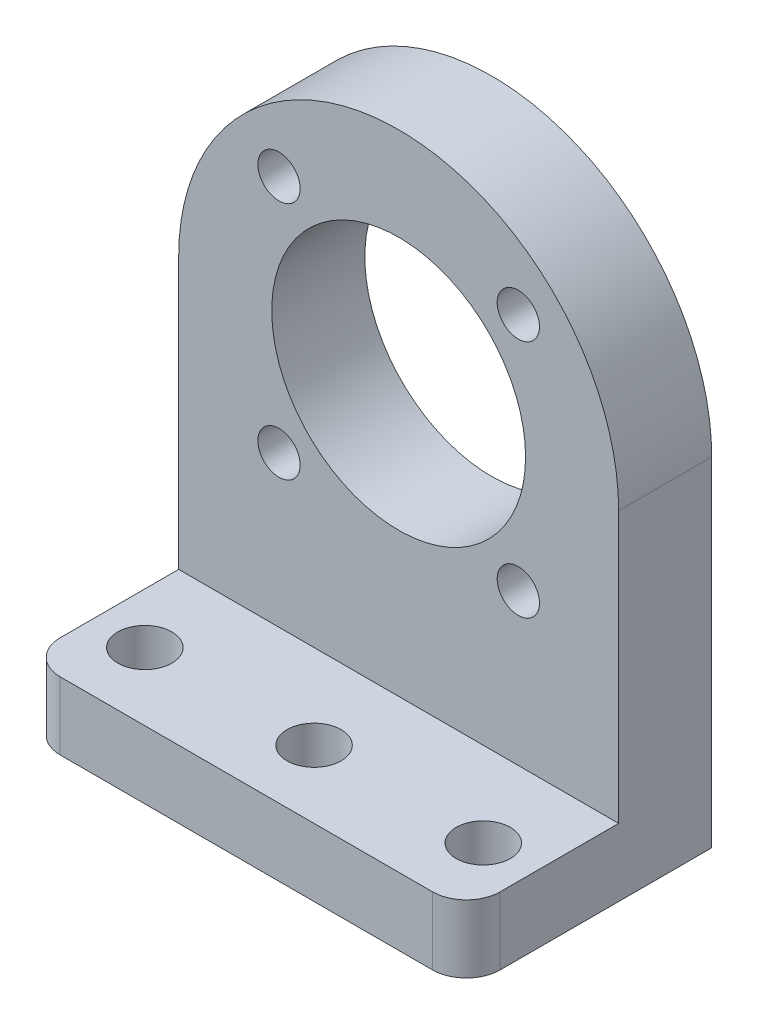
ISO-10303-21;
HEADER;
FILE_DESCRIPTION(('STEP AP214'),'2;1');
FILE_NAME('part.step','',(''),(''),'','','');
FILE_SCHEMA(('AUTOMOTIVE_DESIGN { 1 0 10303 214 1 1 1 1 }'));
ENDSEC;
DATA;
#1=APPLICATION_CONTEXT('core data for automotive mechanical design processes');
#2=APPLICATION_PROTOCOL_DEFINITION('international standard','automotive_design',2000,#1);
#3=PRODUCT_CONTEXT('',#1,'mechanical');
#4=PRODUCT('Part','Part','',(#3));
#5=PRODUCT_RELATED_PRODUCT_CATEGORY('part','',(#4));
#6=PRODUCT_DEFINITION_FORMATION('','',#4);
#7=PRODUCT_DEFINITION_CONTEXT('part definition',#1,'design');
#8=PRODUCT_DEFINITION('design','',#6,#7);
#9=PRODUCT_DEFINITION_SHAPE('','',#8);
#10=(LENGTH_UNIT() NAMED_UNIT(*) SI_UNIT(.MILLI.,.METRE.));
#11=(NAMED_UNIT(*) PLANE_ANGLE_UNIT() SI_UNIT($,.RADIAN.));
#12=(NAMED_UNIT(*) SI_UNIT($,.STERADIAN.) SOLID_ANGLE_UNIT());
#13=UNCERTAINTY_MEASURE_WITH_UNIT(LENGTH_MEASURE(1.E-05),#10,'distance_accuracy_value','');
#14=(GEOMETRIC_REPRESENTATION_CONTEXT(3) GLOBAL_UNCERTAINTY_ASSIGNED_CONTEXT((#13)) GLOBAL_UNIT_ASSIGNED_CONTEXT((#10,
#11,#12)) REPRESENTATION_CONTEXT('',''));
#15=CARTESIAN_POINT('',(0.,0.,0.));
#16=DIRECTION('',(0.,0.,1.));
#17=DIRECTION('',(1.,0.,0.));
#18=AXIS2_PLACEMENT_3D('',#15,#16,#17);
#19=CARTESIAN_POINT('',(0.,0.,5.5));
#20=DIRECTION('',(0.,0.,1.));
#21=DIRECTION('',(1.,0.,0.));
#22=AXIS2_PLACEMENT_3D('',#19,#20,#21);
#23=PLANE('',#22);
#24=DIRECTION('',(-1.,0.,0.));
#25=VECTOR('',#24,1.);
#26=CARTESIAN_POINT('',(-13.,-16.,5.5));
#27=LINE('',#26,#25);
#28=CARTESIAN_POINT('',(13.,-16.,5.5));
#29=VERTEX_POINT('',#28);
#30=CARTESIAN_POINT('',(-13.,-16.,5.5));
#31=VERTEX_POINT('',#30);
#32=EDGE_CURVE('E123',#29,#31,#27,.T.);
#33=ORIENTED_EDGE('',*,*,#32,.F.);
#34=DIRECTION('',(0.,1.,0.));
#35=VECTOR('',#34,1.);
#36=CARTESIAN_POINT('',(13.,-20.,5.5));
#37=LINE('',#36,#35);
#38=CARTESIAN_POINT('',(13.,0.,5.5));
#39=VERTEX_POINT('',#38);
#40=EDGE_CURVE('E129',#29,#39,#37,.T.);
#41=ORIENTED_EDGE('',*,*,#40,.T.);
#42=CARTESIAN_POINT('',(0.,0.,5.5));
#43=DIRECTION('',(0.,0.,1.));
#44=DIRECTION('',(1.,0.,0.));
#45=AXIS2_PLACEMENT_3D('',#42,#43,#44);
#46=CIRCLE('',#45,13.);
#47=CARTESIAN_POINT('',(-13.,0.,5.5));
#48=VERTEX_POINT('',#47);
#49=EDGE_CURVE('E126',#39,#48,#46,.T.);
#50=ORIENTED_EDGE('',*,*,#49,.T.);
#51=DIRECTION('',(0.,-1.,0.));
#52=VECTOR('',#51,1.);
#53=CARTESIAN_POINT('',(-13.,0.,5.5));
#54=LINE('',#53,#52);
#55=EDGE_CURVE('E110',#48,#31,#54,.T.);
#56=ORIENTED_EDGE('',*,*,#55,.T.);
#57=EDGE_LOOP('',(#33,#41,#50,#56));
#58=FACE_BOUND('',#57,.T.);
#59=CARTESIAN_POINT('',(7.07106781186552,-7.07106781186543,5.5));
#60=DIRECTION('',(0.,0.,1.));
#61=DIRECTION('',(1.,0.,0.));
#62=AXIS2_PLACEMENT_3D('',#59,#60,#61);
#63=CIRCLE('',#62,1.25);
#64=CARTESIAN_POINT('',(8.32106781186552,-7.07106781186543,5.5));
#65=VERTEX_POINT('',#64);
#66=EDGE_CURVE('E157',#65,#65,#63,.T.);
#67=ORIENTED_EDGE('',*,*,#66,.F.);
#68=EDGE_LOOP('',(#67));
#69=FACE_BOUND('',#68,.T.);
#70=CARTESIAN_POINT('',(-7.07106781186551,7.07106781186543,5.5));
#71=DIRECTION('',(0.,0.,1.));
#72=DIRECTION('',(1.,0.,0.));
#73=AXIS2_PLACEMENT_3D('',#70,#71,#72);
#74=CIRCLE('',#73,1.25);
#75=CARTESIAN_POINT('',(-5.82106781186551,7.07106781186543,5.5));
#76=VERTEX_POINT('',#75);
#77=EDGE_CURVE('E173',#76,#76,#74,.T.);
#78=ORIENTED_EDGE('',*,*,#77,.F.);
#79=EDGE_LOOP('',(#78));
#80=FACE_BOUND('',#79,.T.);
#81=CARTESIAN_POINT('',(0.,0.,5.5));
#82=DIRECTION('',(0.,0.,1.));
#83=DIRECTION('',(1.,0.,0.));
#84=AXIS2_PLACEMENT_3D('',#81,#82,#83);
#85=CIRCLE('',#84,7.5);
#86=CARTESIAN_POINT('',(7.5,0.,5.5));
#87=VERTEX_POINT('',#86);
#88=EDGE_CURVE('E181',#87,#87,#85,.T.);
#89=ORIENTED_EDGE('',*,*,#88,.F.);
#90=EDGE_LOOP('',(#89));
#91=FACE_BOUND('',#90,.T.);
#92=CARTESIAN_POINT('',(7.07106781186544,7.07106781186551,5.5));
#93=DIRECTION('',(0.,0.,1.));
#94=DIRECTION('',(1.,0.,0.));
#95=AXIS2_PLACEMENT_3D('',#92,#93,#94);
#96=CIRCLE('',#95,1.25);
#97=CARTESIAN_POINT('',(8.32106781186544,7.07106781186551,5.5));
#98=VERTEX_POINT('',#97);
#99=EDGE_CURVE('E165',#98,#98,#96,.T.);
#100=ORIENTED_EDGE('',*,*,#99,.F.);
#101=EDGE_LOOP('',(#100));
#102=FACE_BOUND('',#101,.T.);
#103=CARTESIAN_POINT('',(-7.07106781186543,-7.07106781186552,5.5));
#104=DIRECTION('',(0.,0.,1.));
#105=DIRECTION('',(1.,0.,0.));
#106=AXIS2_PLACEMENT_3D('',#103,#104,#105);
#107=CIRCLE('',#106,1.25);
#108=CARTESIAN_POINT('',(-5.82106781186543,-7.07106781186552,5.5));
#109=VERTEX_POINT('',#108);
#110=EDGE_CURVE('E149',#109,#109,#107,.T.);
#111=ORIENTED_EDGE('',*,*,#110,.F.);
#112=EDGE_LOOP('',(#111));
#113=FACE_BOUND('',#112,.T.);
#114=ADVANCED_FACE('F41',(#58,#69,#80,#91,#102,#113),#23,.T.);
#115=CARTESIAN_POINT('',(0.,0.,0.));
#116=DIRECTION('',(0.,0.,1.));
#117=DIRECTION('',(1.,0.,0.));
#118=AXIS2_PLACEMENT_3D('',#115,#116,#117);
#119=PLANE('',#118);
#120=CARTESIAN_POINT('',(0.,0.,0.));
#121=DIRECTION('',(0.,0.,1.));
#122=DIRECTION('',(1.,0.,0.));
#123=AXIS2_PLACEMENT_3D('',#120,#121,#122);
#124=CIRCLE('',#123,13.);
#125=CARTESIAN_POINT('',(13.,0.,0.));
#126=VERTEX_POINT('',#125);
#127=CARTESIAN_POINT('',(-13.,0.,0.));
#128=VERTEX_POINT('',#127);
#129=EDGE_CURVE('E185',#126,#128,#124,.T.);
#130=ORIENTED_EDGE('',*,*,#129,.F.);
#131=DIRECTION('',(0.,1.,0.));
#132=VECTOR('',#131,1.);
#133=CARTESIAN_POINT('',(13.,-20.,0.));
#134=LINE('',#133,#132);
#135=CARTESIAN_POINT('',(13.,-20.,0.));
#136=VERTEX_POINT('',#135);
#137=EDGE_CURVE('E190',#136,#126,#134,.T.);
#138=ORIENTED_EDGE('',*,*,#137,.F.);
#139=DIRECTION('',(1.,0.,0.));
#140=VECTOR('',#139,1.);
#141=CARTESIAN_POINT('',(-13.,-20.,0.));
#142=LINE('',#141,#140);
#143=CARTESIAN_POINT('',(-13.,-20.,0.));
#144=VERTEX_POINT('',#143);
#145=EDGE_CURVE('E202',#144,#136,#142,.T.);
#146=ORIENTED_EDGE('',*,*,#145,.F.);
#147=DIRECTION('',(0.,-1.,0.));
#148=VECTOR('',#147,1.);
#149=CARTESIAN_POINT('',(-13.,0.,0.));
#150=LINE('',#149,#148);
#151=EDGE_CURVE('E198',#128,#144,#150,.T.);
#152=ORIENTED_EDGE('',*,*,#151,.F.);
#153=EDGE_LOOP('',(#130,#138,#146,#152));
#154=FACE_BOUND('',#153,.T.);
#155=CARTESIAN_POINT('',(0.,0.,0.));
#156=DIRECTION('',(0.,0.,1.));
#157=DIRECTION('',(1.,0.,0.));
#158=AXIS2_PLACEMENT_3D('',#155,#156,#157);
#159=CIRCLE('',#158,7.5);
#160=CARTESIAN_POINT('',(7.5,0.,0.));
#161=VERTEX_POINT('',#160);
#162=EDGE_CURVE('E177',#161,#161,#159,.T.);
#163=ORIENTED_EDGE('',*,*,#162,.T.);
#164=EDGE_LOOP('',(#163));
#165=FACE_BOUND('',#164,.T.);
#166=CARTESIAN_POINT('',(-7.07106781186551,7.07106781186543,0.));
#167=DIRECTION('',(0.,0.,1.));
#168=DIRECTION('',(1.,0.,0.));
#169=AXIS2_PLACEMENT_3D('',#166,#167,#168);
#170=CIRCLE('',#169,1.25);
#171=CARTESIAN_POINT('',(-5.82106781186551,7.07106781186543,0.));
#172=VERTEX_POINT('',#171);
#173=EDGE_CURVE('E169',#172,#172,#170,.T.);
#174=ORIENTED_EDGE('',*,*,#173,.T.);
#175=EDGE_LOOP('',(#174));
#176=FACE_BOUND('',#175,.T.);
#177=CARTESIAN_POINT('',(7.07106781186544,7.07106781186551,0.));
#178=DIRECTION('',(0.,0.,1.));
#179=DIRECTION('',(1.,0.,0.));
#180=AXIS2_PLACEMENT_3D('',#177,#178,#179);
#181=CIRCLE('',#180,1.25);
#182=CARTESIAN_POINT('',(8.32106781186544,7.07106781186551,0.));
#183=VERTEX_POINT('',#182);
#184=EDGE_CURVE('E161',#183,#183,#181,.T.);
#185=ORIENTED_EDGE('',*,*,#184,.T.);
#186=EDGE_LOOP('',(#185));
#187=FACE_BOUND('',#186,.T.);
#188=CARTESIAN_POINT('',(7.07106781186552,-7.07106781186543,0.));
#189=DIRECTION('',(0.,0.,1.));
#190=DIRECTION('',(1.,0.,0.));
#191=AXIS2_PLACEMENT_3D('',#188,#189,#190);
#192=CIRCLE('',#191,1.25);
#193=CARTESIAN_POINT('',(8.32106781186552,-7.07106781186543,0.));
#194=VERTEX_POINT('',#193);
#195=EDGE_CURVE('E153',#194,#194,#192,.T.);
#196=ORIENTED_EDGE('',*,*,#195,.T.);
#197=EDGE_LOOP('',(#196));
#198=FACE_BOUND('',#197,.T.);
#199=CARTESIAN_POINT('',(-7.07106781186543,-7.07106781186552,0.));
#200=DIRECTION('',(0.,0.,1.));
#201=DIRECTION('',(1.,0.,0.));
#202=AXIS2_PLACEMENT_3D('',#199,#200,#201);
#203=CIRCLE('',#202,1.25);
#204=CARTESIAN_POINT('',(-5.82106781186543,-7.07106781186552,0.));
#205=VERTEX_POINT('',#204);
#206=EDGE_CURVE('E148',#205,#205,#203,.T.);
#207=ORIENTED_EDGE('',*,*,#206,.T.);
#208=EDGE_LOOP('',(#207));
#209=FACE_BOUND('',#208,.T.);
#210=ADVANCED_FACE('F255',(#154,#165,#176,#187,#198,#209),#119,.F.);
#211=CARTESIAN_POINT('',(0.,0.,5.5));
#212=DIRECTION('',(0.,0.,-1.));
#213=DIRECTION('',(-1.,0.,0.));
#214=AXIS2_PLACEMENT_3D('',#211,#212,#213);
#215=CYLINDRICAL_SURFACE('',#214,13.);
#216=ORIENTED_EDGE('',*,*,#129,.T.);
#217=DIRECTION('',(0.,0.,-1.));
#218=VECTOR('',#217,1.);
#219=CARTESIAN_POINT('',(-13.,0.,5.5));
#220=LINE('',#219,#218);
#221=EDGE_CURVE('E217',#48,#128,#220,.T.);
#222=ORIENTED_EDGE('',*,*,#221,.F.);
#223=ORIENTED_EDGE('',*,*,#49,.F.);
#224=DIRECTION('',(0.,0.,-1.));
#225=VECTOR('',#224,1.);
#226=CARTESIAN_POINT('',(13.,0.,5.5));
#227=LINE('',#226,#225);
#228=EDGE_CURVE('E194',#39,#126,#227,.T.);
#229=ORIENTED_EDGE('',*,*,#228,.T.);
#230=EDGE_LOOP('',(#216,#222,#223,#229));
#231=FACE_BOUND('',#230,.T.);
#232=ADVANCED_FACE('F252',(#231),#215,.T.);
#233=CARTESIAN_POINT('',(-13.,0.,5.5));
#234=DIRECTION('',(1.,0.,0.));
#235=DIRECTION('',(0.,1.,0.));
#236=AXIS2_PLACEMENT_3D('',#233,#234,#235);
#237=PLANE('',#236);
#238=DIRECTION('',(0.,0.,-1.));
#239=VECTOR('',#238,1.);
#240=CARTESIAN_POINT('',(-13.,-20.,5.5));
#241=LINE('',#240,#239);
#242=CARTESIAN_POINT('',(-13.,-20.,12.5));
#243=VERTEX_POINT('',#242);
#244=EDGE_CURVE('E214',#243,#144,#241,.T.);
#245=ORIENTED_EDGE('',*,*,#244,.F.);
#246=DIRECTION('',(0.,-1.,0.));
#247=VECTOR('',#246,1.);
#248=CARTESIAN_POINT('',(-13.,-16.,12.5));
#249=LINE('',#248,#247);
#250=CARTESIAN_POINT('',(-13.,-16.,12.5));
#251=VERTEX_POINT('',#250);
#252=EDGE_CURVE('E11',#243,#251,#249,.F.);
#253=ORIENTED_EDGE('',*,*,#252,.T.);
#254=DIRECTION('',(0.,0.,-1.));
#255=VECTOR('',#254,1.);
#256=CARTESIAN_POINT('',(-13.,-16.,14.5));
#257=LINE('',#256,#255);
#258=EDGE_CURVE('E106',#251,#31,#257,.T.);
#259=ORIENTED_EDGE('',*,*,#258,.T.);
#260=ORIENTED_EDGE('',*,*,#55,.F.);
#261=ORIENTED_EDGE('',*,*,#221,.T.);
#262=ORIENTED_EDGE('',*,*,#151,.T.);
#263=EDGE_LOOP('',(#245,#253,#259,#260,#261,#262));
#264=FACE_BOUND('',#263,.T.);
#265=ADVANCED_FACE('F108',(#264),#237,.F.);
#266=CARTESIAN_POINT('',(-13.,-20.,5.5));
#267=DIRECTION('',(0.,1.,0.));
#268=DIRECTION('',(0.,0.,1.));
#269=AXIS2_PLACEMENT_3D('',#266,#267,#268);
#270=PLANE('',#269);
#271=CARTESIAN_POINT('',(-10.,-20.,10.5));
#272=DIRECTION('',(0.,1.,0.));
#273=DIRECTION('',(0.,0.,1.));
#274=AXIS2_PLACEMENT_3D('',#271,#272,#273);
#275=CIRCLE('',#274,1.6);
#276=CARTESIAN_POINT('',(-10.,-20.,12.1));
#277=VERTEX_POINT('',#276);
#278=EDGE_CURVE('E135',#277,#277,#275,.T.);
#279=ORIENTED_EDGE('',*,*,#278,.T.);
#280=EDGE_LOOP('',(#279));
#281=FACE_BOUND('',#280,.T.);
#282=CARTESIAN_POINT('',(0.,-20.,10.5));
#283=DIRECTION('',(0.,1.,0.));
#284=DIRECTION('',(0.,0.,1.));
#285=AXIS2_PLACEMENT_3D('',#282,#283,#284);
#286=CIRCLE('',#285,1.6);
#287=CARTESIAN_POINT('',(0.,-20.,12.1));
#288=VERTEX_POINT('',#287);
#289=EDGE_CURVE('E142',#288,#288,#286,.T.);
#290=ORIENTED_EDGE('',*,*,#289,.T.);
#291=EDGE_LOOP('',(#290));
#292=FACE_BOUND('',#291,.T.);
#293=CARTESIAN_POINT('',(10.,-20.,10.5));
#294=DIRECTION('',(0.,1.,0.));
#295=DIRECTION('',(0.,0.,1.));
#296=AXIS2_PLACEMENT_3D('',#293,#294,#295);
#297=CIRCLE('',#296,1.6);
#298=CARTESIAN_POINT('',(10.,-20.,12.1));
#299=VERTEX_POINT('',#298);
#300=EDGE_CURVE('E464',#299,#299,#297,.T.);
#301=ORIENTED_EDGE('',*,*,#300,.T.);
#302=EDGE_LOOP('',(#301));
#303=FACE_BOUND('',#302,.T.);
#304=DIRECTION('',(0.,0.,-1.));
#305=VECTOR('',#304,1.);
#306=CARTESIAN_POINT('',(13.,-20.,5.5));
#307=LINE('',#306,#305);
#308=CARTESIAN_POINT('',(13.,-20.,12.5));
#309=VERTEX_POINT('',#308);
#310=EDGE_CURVE('E211',#309,#136,#307,.T.);
#311=ORIENTED_EDGE('',*,*,#310,.F.);
#312=CARTESIAN_POINT('',(11.,-20.,12.5));
#313=DIRECTION('',(0.,1.,0.));
#314=DIRECTION('',(0.,0.,1.));
#315=AXIS2_PLACEMENT_3D('',#312,#313,#314);
#316=CIRCLE('',#315,2.);
#317=CARTESIAN_POINT('',(11.,-20.,14.5));
#318=VERTEX_POINT('',#317);
#319=EDGE_CURVE('E50',#309,#318,#316,.F.);
#320=ORIENTED_EDGE('',*,*,#319,.T.);
#321=DIRECTION('',(1.,0.,0.));
#322=VECTOR('',#321,1.);
#323=CARTESIAN_POINT('',(-13.,-20.,14.5));
#324=LINE('',#323,#322);
#325=CARTESIAN_POINT('',(-11.,-20.,14.5));
#326=VERTEX_POINT('',#325);
#327=EDGE_CURVE('E134',#326,#318,#324,.T.);
#328=ORIENTED_EDGE('',*,*,#327,.F.);
#329=CARTESIAN_POINT('',(-11.,-20.,12.5));
#330=DIRECTION('',(0.,1.,0.));
#331=DIRECTION('',(0.,0.,1.));
#332=AXIS2_PLACEMENT_3D('',#329,#330,#331);
#333=CIRCLE('',#332,2.);
#334=EDGE_CURVE('E57',#326,#243,#333,.F.);
#335=ORIENTED_EDGE('',*,*,#334,.T.);
#336=ORIENTED_EDGE('',*,*,#244,.T.);
#337=ORIENTED_EDGE('',*,*,#145,.T.);
#338=EDGE_LOOP('',(#311,#320,#328,#335,#336,#337));
#339=FACE_BOUND('',#338,.T.);
#340=ADVANCED_FACE('F239',(#281,#292,#303,#339),#270,.F.);
#341=CARTESIAN_POINT('',(13.,-20.,5.5));
#342=DIRECTION('',(-1.,0.,0.));
#343=DIRECTION('',(0.,-1.,0.));
#344=AXIS2_PLACEMENT_3D('',#341,#342,#343);
#345=PLANE('',#344);
#346=DIRECTION('',(0.,0.,-1.));
#347=VECTOR('',#346,1.);
#348=CARTESIAN_POINT('',(13.,-16.,14.5));
#349=LINE('',#348,#347);
#350=CARTESIAN_POINT('',(13.,-16.,12.5));
#351=VERTEX_POINT('',#350);
#352=EDGE_CURVE('E117',#351,#29,#349,.T.);
#353=ORIENTED_EDGE('',*,*,#352,.F.);
#354=DIRECTION('',(0.,1.,0.));
#355=VECTOR('',#354,1.);
#356=CARTESIAN_POINT('',(13.,-20.,12.5));
#357=LINE('',#356,#355);
#358=EDGE_CURVE('E65',#351,#309,#357,.F.);
#359=ORIENTED_EDGE('',*,*,#358,.T.);
#360=ORIENTED_EDGE('',*,*,#310,.T.);
#361=ORIENTED_EDGE('',*,*,#137,.T.);
#362=ORIENTED_EDGE('',*,*,#228,.F.);
#363=ORIENTED_EDGE('',*,*,#40,.F.);
#364=EDGE_LOOP('',(#353,#359,#360,#361,#362,#363));
#365=FACE_BOUND('',#364,.T.);
#366=ADVANCED_FACE('F247',(#365),#345,.F.);
#367=CARTESIAN_POINT('',(0.,0.,5.5));
#368=DIRECTION('',(0.,0.,-1.));
#369=DIRECTION('',(-1.,0.,0.));
#370=AXIS2_PLACEMENT_3D('',#367,#368,#369);
#371=CYLINDRICAL_SURFACE('',#370,7.5);
#372=ORIENTED_EDGE('',*,*,#88,.T.);
#373=EDGE_LOOP('',(#372));
#374=FACE_BOUND('',#373,.T.);
#375=ORIENTED_EDGE('',*,*,#162,.F.);
#376=EDGE_LOOP('',(#375));
#377=FACE_BOUND('',#376,.T.);
#378=ADVANCED_FACE('F288',(#374,#377),#371,.F.);
#379=CARTESIAN_POINT('',(-7.07106781186551,7.07106781186543,5.5));
#380=DIRECTION('',(0.,0.,-1.));
#381=DIRECTION('',(-1.,0.,0.));
#382=AXIS2_PLACEMENT_3D('',#379,#380,#381);
#383=CYLINDRICAL_SURFACE('',#382,1.25);
#384=ORIENTED_EDGE('',*,*,#77,.T.);
#385=EDGE_LOOP('',(#384));
#386=FACE_BOUND('',#385,.T.);
#387=ORIENTED_EDGE('',*,*,#173,.F.);
#388=EDGE_LOOP('',(#387));
#389=FACE_BOUND('',#388,.T.);
#390=ADVANCED_FACE('F377',(#386,#389),#383,.F.);
#391=CARTESIAN_POINT('',(7.07106781186544,7.07106781186551,5.5));
#392=DIRECTION('',(0.,0.,-1.));
#393=DIRECTION('',(-1.,0.,0.));
#394=AXIS2_PLACEMENT_3D('',#391,#392,#393);
#395=CYLINDRICAL_SURFACE('',#394,1.25);
#396=ORIENTED_EDGE('',*,*,#99,.T.);
#397=EDGE_LOOP('',(#396));
#398=FACE_BOUND('',#397,.T.);
#399=ORIENTED_EDGE('',*,*,#184,.F.);
#400=EDGE_LOOP('',(#399));
#401=FACE_BOUND('',#400,.T.);
#402=ADVANCED_FACE('F280',(#398,#401),#395,.F.);
#403=CARTESIAN_POINT('',(7.07106781186552,-7.07106781186543,5.5));
#404=DIRECTION('',(0.,0.,-1.));
#405=DIRECTION('',(-1.,0.,0.));
#406=AXIS2_PLACEMENT_3D('',#403,#404,#405);
#407=CYLINDRICAL_SURFACE('',#406,1.25);
#408=ORIENTED_EDGE('',*,*,#66,.T.);
#409=EDGE_LOOP('',(#408));
#410=FACE_BOUND('',#409,.T.);
#411=ORIENTED_EDGE('',*,*,#195,.F.);
#412=EDGE_LOOP('',(#411));
#413=FACE_BOUND('',#412,.T.);
#414=ADVANCED_FACE('F271',(#410,#413),#407,.F.);
#415=CARTESIAN_POINT('',(-7.07106781186543,-7.07106781186552,5.5));
#416=DIRECTION('',(0.,0.,-1.));
#417=DIRECTION('',(-1.,0.,0.));
#418=AXIS2_PLACEMENT_3D('',#415,#416,#417);
#419=CYLINDRICAL_SURFACE('',#418,1.25);
#420=ORIENTED_EDGE('',*,*,#110,.T.);
#421=EDGE_LOOP('',(#420));
#422=FACE_BOUND('',#421,.T.);
#423=ORIENTED_EDGE('',*,*,#206,.F.);
#424=EDGE_LOOP('',(#423));
#425=FACE_BOUND('',#424,.T.);
#426=ADVANCED_FACE('F269',(#422,#425),#419,.F.);
#427=CARTESIAN_POINT('',(-13.,-16.,14.5));
#428=DIRECTION('',(0.,-1.,0.));
#429=DIRECTION('',(0.,0.,-1.));
#430=AXIS2_PLACEMENT_3D('',#427,#428,#429);
#431=PLANE('',#430);
#432=CARTESIAN_POINT('',(-10.,-16.,10.5));
#433=DIRECTION('',(0.,1.,0.));
#434=DIRECTION('',(0.,0.,1.));
#435=AXIS2_PLACEMENT_3D('',#432,#433,#434);
#436=CIRCLE('',#435,1.6);
#437=CARTESIAN_POINT('',(-10.,-16.,12.1));
#438=VERTEX_POINT('',#437);
#439=EDGE_CURVE('E467',#438,#438,#436,.T.);
#440=ORIENTED_EDGE('',*,*,#439,.F.);
#441=EDGE_LOOP('',(#440));
#442=FACE_BOUND('',#441,.T.);
#443=CARTESIAN_POINT('',(0.,-16.,10.5));
#444=DIRECTION('',(0.,1.,0.));
#445=DIRECTION('',(0.,0.,1.));
#446=AXIS2_PLACEMENT_3D('',#443,#444,#445);
#447=CIRCLE('',#446,1.6);
#448=CARTESIAN_POINT('',(0.,-16.,12.1));
#449=VERTEX_POINT('',#448);
#450=EDGE_CURVE('E473',#449,#449,#447,.T.);
#451=ORIENTED_EDGE('',*,*,#450,.F.);
#452=EDGE_LOOP('',(#451));
#453=FACE_BOUND('',#452,.T.);
#454=CARTESIAN_POINT('',(10.,-16.,10.5));
#455=DIRECTION('',(0.,1.,0.));
#456=DIRECTION('',(0.,0.,1.));
#457=AXIS2_PLACEMENT_3D('',#454,#455,#456);
#458=CIRCLE('',#457,1.6);
#459=CARTESIAN_POINT('',(10.,-16.,12.1));
#460=VERTEX_POINT('',#459);
#461=EDGE_CURVE('E461',#460,#460,#458,.T.);
#462=ORIENTED_EDGE('',*,*,#461,.F.);
#463=EDGE_LOOP('',(#462));
#464=FACE_BOUND('',#463,.T.);
#465=DIRECTION('',(-1.,0.,0.));
#466=VECTOR('',#465,1.);
#467=CARTESIAN_POINT('',(-13.,-16.,14.5));
#468=LINE('',#467,#466);
#469=CARTESIAN_POINT('',(11.,-16.,14.5));
#470=VERTEX_POINT('',#469);
#471=CARTESIAN_POINT('',(-11.,-16.,14.5));
#472=VERTEX_POINT('',#471);
#473=EDGE_CURVE('E118',#470,#472,#468,.T.);
#474=ORIENTED_EDGE('',*,*,#473,.F.);
#475=CARTESIAN_POINT('',(11.,-16.,12.5));
#476=DIRECTION('',(0.,-1.,0.));
#477=DIRECTION('',(0.,0.,-1.));
#478=AXIS2_PLACEMENT_3D('',#475,#476,#477);
#479=CIRCLE('',#478,2.);
#480=EDGE_CURVE('E231',#470,#351,#479,.F.);
#481=ORIENTED_EDGE('',*,*,#480,.T.);
#482=ORIENTED_EDGE('',*,*,#352,.T.);
#483=ORIENTED_EDGE('',*,*,#32,.T.);
#484=ORIENTED_EDGE('',*,*,#258,.F.);
#485=CARTESIAN_POINT('',(-11.,-16.,12.5));
#486=DIRECTION('',(0.,-1.,0.));
#487=DIRECTION('',(0.,0.,-1.));
#488=AXIS2_PLACEMENT_3D('',#485,#486,#487);
#489=CIRCLE('',#488,2.);
#490=EDGE_CURVE('E228',#251,#472,#489,.F.);
#491=ORIENTED_EDGE('',*,*,#490,.T.);
#492=EDGE_LOOP('',(#474,#481,#482,#483,#484,#491));
#493=FACE_BOUND('',#492,.T.);
#494=ADVANCED_FACE('F132',(#442,#453,#464,#493),#431,.F.);
#495=CARTESIAN_POINT('',(0.,0.,14.5));
#496=DIRECTION('',(0.,0.,1.));
#497=DIRECTION('',(1.,0.,0.));
#498=AXIS2_PLACEMENT_3D('',#495,#496,#497);
#499=PLANE('',#498);
#500=ORIENTED_EDGE('',*,*,#327,.T.);
#501=DIRECTION('',(0.,1.,0.));
#502=VECTOR('',#501,1.);
#503=CARTESIAN_POINT('',(11.,-16.,14.5));
#504=LINE('',#503,#502);
#505=EDGE_CURVE('E224',#318,#470,#504,.T.);
#506=ORIENTED_EDGE('',*,*,#505,.T.);
#507=ORIENTED_EDGE('',*,*,#473,.T.);
#508=DIRECTION('',(0.,-1.,0.));
#509=VECTOR('',#508,1.);
#510=CARTESIAN_POINT('',(-11.,-20.,14.5));
#511=LINE('',#510,#509);
#512=EDGE_CURVE('E220',#472,#326,#511,.T.);
#513=ORIENTED_EDGE('',*,*,#512,.T.);
#514=EDGE_LOOP('',(#500,#506,#507,#513));
#515=FACE_BOUND('',#514,.T.);
#516=ADVANCED_FACE('F243',(#515),#499,.T.);
#517=CARTESIAN_POINT('',(10.,-28.,10.5));
#518=DIRECTION('',(0.,1.,0.));
#519=DIRECTION('',(0.,0.,1.));
#520=AXIS2_PLACEMENT_3D('',#517,#518,#519);
#521=CYLINDRICAL_SURFACE('',#520,1.6);
#522=ORIENTED_EDGE('',*,*,#461,.T.);
#523=EDGE_LOOP('',(#522));
#524=FACE_BOUND('',#523,.T.);
#525=ORIENTED_EDGE('',*,*,#300,.F.);
#526=EDGE_LOOP('',(#525));
#527=FACE_BOUND('',#526,.T.);
#528=ADVANCED_FACE('F312',(#524,#527),#521,.F.);
#529=CARTESIAN_POINT('',(0.,-28.,10.5));
#530=DIRECTION('',(0.,1.,0.));
#531=DIRECTION('',(0.,0.,1.));
#532=AXIS2_PLACEMENT_3D('',#529,#530,#531);
#533=CYLINDRICAL_SURFACE('',#532,1.6);
#534=ORIENTED_EDGE('',*,*,#450,.T.);
#535=EDGE_LOOP('',(#534));
#536=FACE_BOUND('',#535,.T.);
#537=ORIENTED_EDGE('',*,*,#289,.F.);
#538=EDGE_LOOP('',(#537));
#539=FACE_BOUND('',#538,.T.);
#540=ADVANCED_FACE('F306',(#536,#539),#533,.F.);
#541=CARTESIAN_POINT('',(-10.,-28.,10.5));
#542=DIRECTION('',(0.,1.,0.));
#543=DIRECTION('',(0.,0.,1.));
#544=AXIS2_PLACEMENT_3D('',#541,#542,#543);
#545=CYLINDRICAL_SURFACE('',#544,1.6);
#546=ORIENTED_EDGE('',*,*,#439,.T.);
#547=EDGE_LOOP('',(#546));
#548=FACE_BOUND('',#547,.T.);
#549=ORIENTED_EDGE('',*,*,#278,.F.);
#550=EDGE_LOOP('',(#549));
#551=FACE_BOUND('',#550,.T.);
#552=ADVANCED_FACE('F300',(#548,#551),#545,.F.);
#553=CARTESIAN_POINT('',(11.,0.,12.5));
#554=DIRECTION('',(0.,-1.,0.));
#555=DIRECTION('',(1.,0.,0.));
#556=AXIS2_PLACEMENT_3D('',#553,#554,#555);
#557=CYLINDRICAL_SURFACE('',#556,2.);
#558=ORIENTED_EDGE('',*,*,#319,.F.);
#559=ORIENTED_EDGE('',*,*,#358,.F.);
#560=ORIENTED_EDGE('',*,*,#480,.F.);
#561=ORIENTED_EDGE('',*,*,#505,.F.);
#562=EDGE_LOOP('',(#558,#559,#560,#561));
#563=FACE_BOUND('',#562,.T.);
#564=ADVANCED_FACE('F246',(#563),#557,.T.);
#565=CARTESIAN_POINT('',(-11.,0.,12.5));
#566=DIRECTION('',(0.,1.,0.));
#567=DIRECTION('',(-1.,0.,0.));
#568=AXIS2_PLACEMENT_3D('',#565,#566,#567);
#569=CYLINDRICAL_SURFACE('',#568,2.);
#570=ORIENTED_EDGE('',*,*,#490,.F.);
#571=ORIENTED_EDGE('',*,*,#252,.F.);
#572=ORIENTED_EDGE('',*,*,#334,.F.);
#573=ORIENTED_EDGE('',*,*,#512,.F.);
#574=EDGE_LOOP('',(#570,#571,#572,#573));
#575=FACE_BOUND('',#574,.T.);
#576=ADVANCED_FACE('F43',(#575),#569,.T.);
#577=CLOSED_SHELL('',(#114,#210,#232,#265,#340,#366,#378,#390,#402,#414,#426,#494,#516,#528,
#540,#552,#564,#576));
#578=MANIFOLD_SOLID_BREP('B2',#577);
#579=ADVANCED_BREP_SHAPE_REPRESENTATION('',(#18,#578),#14);
#580=SHAPE_DEFINITION_REPRESENTATION(#9,#579);
ENDSEC;
END-ISO-10303-21;
